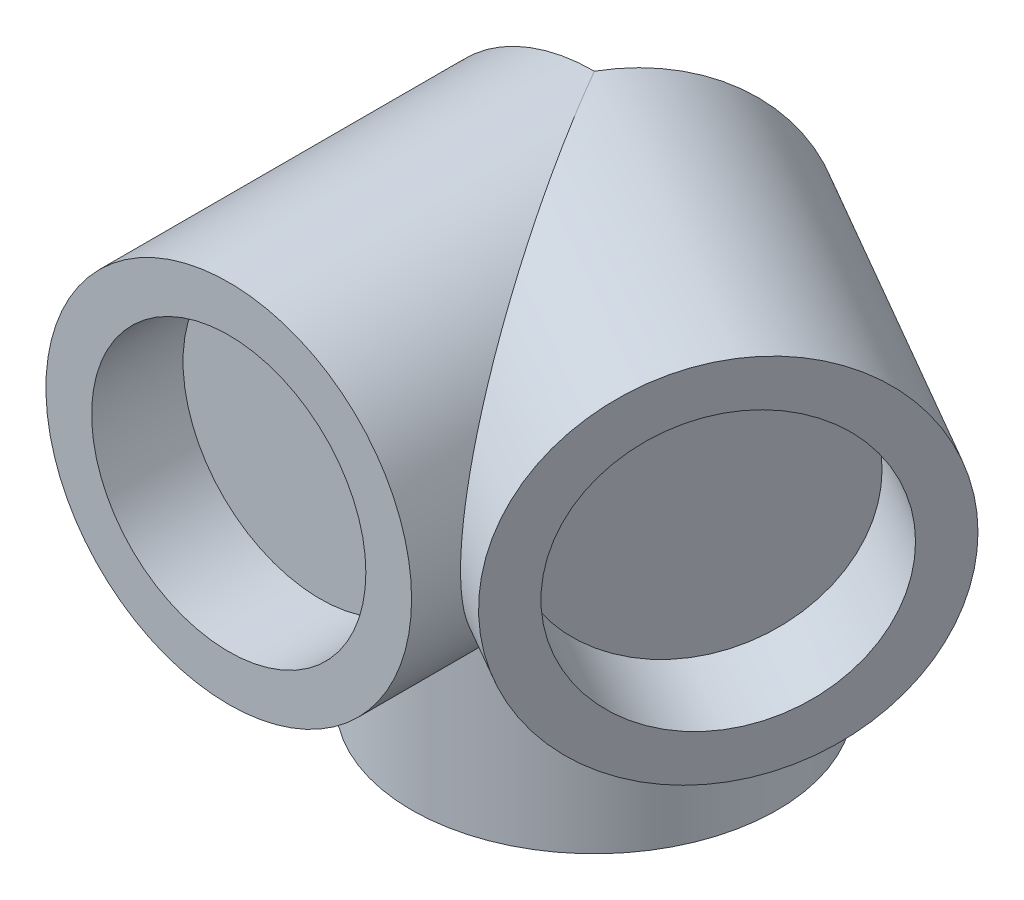
ISO-10303-21;
HEADER;
FILE_DESCRIPTION(('STEP AP214'),'2;1');
FILE_NAME('part.step','',(''),(''),'','','');
FILE_SCHEMA(('AUTOMOTIVE_DESIGN { 1 0 10303 214 1 1 1 1 }'));
ENDSEC;
DATA;
#1=APPLICATION_CONTEXT('core data for automotive mechanical design processes');
#2=APPLICATION_PROTOCOL_DEFINITION('international standard','automotive_design',2000,#1);
#3=PRODUCT_CONTEXT('',#1,'mechanical');
#4=PRODUCT('Part','Part','',(#3));
#5=PRODUCT_RELATED_PRODUCT_CATEGORY('part','',(#4));
#6=PRODUCT_DEFINITION_FORMATION('','',#4);
#7=PRODUCT_DEFINITION_CONTEXT('part definition',#1,'design');
#8=PRODUCT_DEFINITION('design','',#6,#7);
#9=PRODUCT_DEFINITION_SHAPE('','',#8);
#10=(LENGTH_UNIT() NAMED_UNIT(*) SI_UNIT(.MILLI.,.METRE.));
#11=(NAMED_UNIT(*) PLANE_ANGLE_UNIT() SI_UNIT($,.RADIAN.));
#12=(NAMED_UNIT(*) SI_UNIT($,.STERADIAN.) SOLID_ANGLE_UNIT());
#13=UNCERTAINTY_MEASURE_WITH_UNIT(LENGTH_MEASURE(1.E-05),#10,'distance_accuracy_value','');
#14=(GEOMETRIC_REPRESENTATION_CONTEXT(3) GLOBAL_UNCERTAINTY_ASSIGNED_CONTEXT((#13)) GLOBAL_UNIT_ASSIGNED_CONTEXT((#10,
#11,#12)) REPRESENTATION_CONTEXT('',''));
#15=CARTESIAN_POINT('',(0.,0.,0.));
#16=DIRECTION('',(0.,0.,1.));
#17=DIRECTION('',(1.,0.,0.));
#18=AXIS2_PLACEMENT_3D('',#15,#16,#17);
#19=CARTESIAN_POINT('',(17.3205080756888,10.,10.));
#20=DIRECTION('',(-0.866025403784438,0.,-0.500000000000001));
#21=DIRECTION('',(-0.500000000000001,0.,0.866025403784438));
#22=AXIS2_PLACEMENT_3D('',#19,#20,#21);
#23=CYLINDRICAL_SURFACE('',#22,10.);
#24=CARTESIAN_POINT('',(17.3205080756888,10.,10.));
#25=DIRECTION('',(0.866025403784438,0.,0.500000000000001));
#26=DIRECTION('',(0.500000000000001,0.,-0.866025403784438));
#27=AXIS2_PLACEMENT_3D('',#24,#25,#26);
#28=CIRCLE('',#27,10.);
#29=CARTESIAN_POINT('',(22.3205080756888,10.,1.33974596215564));
#30=VERTEX_POINT('',#29);
#31=EDGE_CURVE('E51',#30,#30,#28,.T.);
#32=ORIENTED_EDGE('',*,*,#31,.F.);
#33=EDGE_LOOP('',(#32));
#34=FACE_BOUND('',#33,.T.);
#35=CARTESIAN_POINT('',(0.,10.,0.));
#36=DIRECTION('',(-0.866025403784439,0.,0.5));
#37=DIRECTION('',(-0.5,0.,-0.866025403784439));
#38=AXIS2_PLACEMENT_3D('',#35,#36,#37);
#39=ELLIPSE('',#38,20.,10.);
#40=CARTESIAN_POINT('',(0.,0.,0.));
#41=VERTEX_POINT('',#40);
#42=CARTESIAN_POINT('',(0.,20.,0.));
#43=VERTEX_POINT('',#42);
#44=EDGE_CURVE('E62',#41,#43,#39,.T.);
#45=ORIENTED_EDGE('',*,*,#44,.F.);
#46=CARTESIAN_POINT('',(0.,10.,0.));
#47=DIRECTION('',(0.866025403784438,0.,0.500000000000001));
#48=DIRECTION('',(0.500000000000001,0.,-0.866025403784438));
#49=AXIS2_PLACEMENT_3D('',#46,#47,#48);
#50=CIRCLE('',#49,10.);
#51=EDGE_CURVE('E57',#41,#43,#50,.T.);
#52=ORIENTED_EDGE('',*,*,#51,.T.);
#53=EDGE_LOOP('',(#45,#52));
#54=FACE_BOUND('',#53,.T.);
#55=ADVANCED_FACE('F44',(#34,#54),#23,.T.);
#56=CARTESIAN_POINT('',(0.,10.,0.));
#57=DIRECTION('',(0.866025403784438,0.,0.500000000000001));
#58=DIRECTION('',(0.500000000000001,0.,-0.866025403784438));
#59=AXIS2_PLACEMENT_3D('',#56,#57,#58);
#60=PLANE('',#59);
#61=DIRECTION('',(0.,-1.,0.));
#62=VECTOR('',#61,1.);
#63=CARTESIAN_POINT('',(0.,10.,0.));
#64=LINE('',#63,#62);
#65=EDGE_CURVE('E12',#43,#41,#64,.T.);
#66=ORIENTED_EDGE('',*,*,#65,.F.);
#67=ORIENTED_EDGE('',*,*,#51,.F.);
#68=EDGE_LOOP('',(#66,#67));
#69=FACE_BOUND('',#68,.T.);
#70=ADVANCED_FACE('F59',(#69),#60,.F.);
#71=CARTESIAN_POINT('',(17.3205080756888,10.,10.));
#72=DIRECTION('',(0.866025403784438,0.,0.500000000000001));
#73=DIRECTION('',(0.500000000000001,0.,-0.866025403784438));
#74=AXIS2_PLACEMENT_3D('',#71,#72,#73);
#75=PLANE('',#74);
#76=CARTESIAN_POINT('',(17.3205080756888,10.,10.));
#77=DIRECTION('',(0.866025403784438,0.,0.500000000000001));
#78=DIRECTION('',(0.500000000000001,0.,-0.866025403784438));
#79=AXIS2_PLACEMENT_3D('',#76,#77,#78);
#80=CIRCLE('',#79,7.5);
#81=CARTESIAN_POINT('',(21.0705080756888,10.,3.50480947161674));
#82=VERTEX_POINT('',#81);
#83=EDGE_CURVE('E125',#82,#82,#80,.T.);
#84=ORIENTED_EDGE('',*,*,#83,.F.);
#85=EDGE_LOOP('',(#84));
#86=FACE_BOUND('',#85,.T.);
#87=ORIENTED_EDGE('',*,*,#31,.T.);
#88=EDGE_LOOP('',(#87));
#89=FACE_BOUND('',#88,.T.);
#90=ADVANCED_FACE('F84',(#86,#89),#75,.T.);
#91=CARTESIAN_POINT('',(0.,10.,20.));
#92=DIRECTION('',(0.,0.,-1.));
#93=DIRECTION('',(-1.,0.,0.));
#94=AXIS2_PLACEMENT_3D('',#91,#92,#93);
#95=CYLINDRICAL_SURFACE('',#94,10.);
#96=CARTESIAN_POINT('',(0.,10.,20.));
#97=DIRECTION('',(0.,0.,1.));
#98=DIRECTION('',(1.,0.,0.));
#99=AXIS2_PLACEMENT_3D('',#96,#97,#98);
#100=CIRCLE('',#99,10.);
#101=CARTESIAN_POINT('',(10.,10.,20.));
#102=VERTEX_POINT('',#101);
#103=EDGE_CURVE('E66',#102,#102,#100,.T.);
#104=ORIENTED_EDGE('',*,*,#103,.F.);
#105=EDGE_LOOP('',(#104));
#106=FACE_BOUND('',#105,.T.);
#107=CARTESIAN_POINT('',(0.,10.,0.));
#108=DIRECTION('',(0.,0.,1.));
#109=DIRECTION('',(1.,0.,0.));
#110=AXIS2_PLACEMENT_3D('',#107,#108,#109);
#111=CIRCLE('',#110,10.);
#112=EDGE_CURVE('E70',#43,#41,#111,.T.);
#113=ORIENTED_EDGE('',*,*,#112,.T.);
#114=ORIENTED_EDGE('',*,*,#44,.T.);
#115=EDGE_LOOP('',(#113,#114));
#116=FACE_BOUND('',#115,.T.);
#117=ADVANCED_FACE('F71',(#106,#116),#95,.T.);
#118=CARTESIAN_POINT('',(0.,10.,0.));
#119=DIRECTION('',(0.,0.,1.));
#120=DIRECTION('',(1.,0.,0.));
#121=AXIS2_PLACEMENT_3D('',#118,#119,#120);
#122=PLANE('',#121);
#123=ORIENTED_EDGE('',*,*,#112,.F.);
#124=ORIENTED_EDGE('',*,*,#65,.T.);
#125=EDGE_LOOP('',(#123,#124));
#126=FACE_BOUND('',#125,.T.);
#127=ADVANCED_FACE('F69',(#126),#122,.F.);
#128=CARTESIAN_POINT('',(0.,10.,20.));
#129=DIRECTION('',(0.,0.,1.));
#130=DIRECTION('',(1.,0.,0.));
#131=AXIS2_PLACEMENT_3D('',#128,#129,#130);
#132=PLANE('',#131);
#133=CARTESIAN_POINT('',(0.,10.,20.));
#134=DIRECTION('',(0.,0.,1.));
#135=DIRECTION('',(1.,0.,0.));
#136=AXIS2_PLACEMENT_3D('',#133,#134,#135);
#137=CIRCLE('',#136,7.5);
#138=CARTESIAN_POINT('',(7.5,10.,20.));
#139=VERTEX_POINT('',#138);
#140=EDGE_CURVE('E77',#139,#139,#137,.T.);
#141=ORIENTED_EDGE('',*,*,#140,.F.);
#142=EDGE_LOOP('',(#141));
#143=FACE_BOUND('',#142,.T.);
#144=ORIENTED_EDGE('',*,*,#103,.T.);
#145=EDGE_LOOP('',(#144));
#146=FACE_BOUND('',#145,.T.);
#147=ADVANCED_FACE('F101',(#143,#146),#132,.T.);
#148=CARTESIAN_POINT('',(0.,10.,15.));
#149=DIRECTION('',(0.,0.,1.));
#150=DIRECTION('',(1.,0.,0.));
#151=AXIS2_PLACEMENT_3D('',#148,#149,#150);
#152=CYLINDRICAL_SURFACE('',#151,7.5);
#153=CARTESIAN_POINT('',(0.,10.,15.));
#154=DIRECTION('',(0.,0.,1.));
#155=DIRECTION('',(1.,0.,0.));
#156=AXIS2_PLACEMENT_3D('',#153,#154,#155);
#157=CIRCLE('',#156,7.5);
#158=CARTESIAN_POINT('',(7.5,10.,15.));
#159=VERTEX_POINT('',#158);
#160=EDGE_CURVE('E72',#159,#159,#157,.T.);
#161=ORIENTED_EDGE('',*,*,#160,.F.);
#162=EDGE_LOOP('',(#161));
#163=FACE_BOUND('',#162,.T.);
#164=ORIENTED_EDGE('',*,*,#140,.T.);
#165=EDGE_LOOP('',(#164));
#166=FACE_BOUND('',#165,.T.);
#167=ADVANCED_FACE('F104',(#163,#166),#152,.F.);
#168=CARTESIAN_POINT('',(0.,10.,15.));
#169=DIRECTION('',(0.,0.,1.));
#170=DIRECTION('',(1.,0.,0.));
#171=AXIS2_PLACEMENT_3D('',#168,#169,#170);
#172=PLANE('',#171);
#173=ORIENTED_EDGE('',*,*,#160,.T.);
#174=EDGE_LOOP('',(#173));
#175=FACE_BOUND('',#174,.T.);
#176=ADVANCED_FACE('F108',(#175),#172,.T.);
#177=CARTESIAN_POINT('',(12.9903810567666,10.,7.50000000000002));
#178=DIRECTION('',(0.866025403784438,0.,0.500000000000001));
#179=DIRECTION('',(0.500000000000001,0.,-0.866025403784438));
#180=AXIS2_PLACEMENT_3D('',#177,#178,#179);
#181=CYLINDRICAL_SURFACE('',#180,7.5);
#182=CARTESIAN_POINT('',(12.9903810567666,10.,7.50000000000002));
#183=DIRECTION('',(0.866025403784438,0.,0.500000000000001));
#184=DIRECTION('',(0.500000000000001,0.,-0.866025403784438));
#185=AXIS2_PLACEMENT_3D('',#182,#183,#184);
#186=CIRCLE('',#185,7.5);
#187=CARTESIAN_POINT('',(16.7403810567666,10.,1.00480947161673));
#188=VERTEX_POINT('',#187);
#189=EDGE_CURVE('E124',#188,#188,#186,.T.);
#190=ORIENTED_EDGE('',*,*,#189,.F.);
#191=EDGE_LOOP('',(#190));
#192=FACE_BOUND('',#191,.T.);
#193=ORIENTED_EDGE('',*,*,#83,.T.);
#194=EDGE_LOOP('',(#193));
#195=FACE_BOUND('',#194,.T.);
#196=ADVANCED_FACE('F112',(#192,#195),#181,.F.);
#197=CARTESIAN_POINT('',(12.9903810567666,10.,7.50000000000002));
#198=DIRECTION('',(0.866025403784438,0.,0.500000000000001));
#199=DIRECTION('',(0.500000000000001,0.,-0.866025403784438));
#200=AXIS2_PLACEMENT_3D('',#197,#198,#199);
#201=PLANE('',#200);
#202=ORIENTED_EDGE('',*,*,#189,.T.);
#203=EDGE_LOOP('',(#202));
#204=FACE_BOUND('',#203,.T.);
#205=ADVANCED_FACE('F116',(#204),#201,.T.);
#206=CLOSED_SHELL('',(#55,#70,#90,#117,#127,#147,#167,#176,#196,#205));
#207=MANIFOLD_SOLID_BREP('B2',#206);
#208=CARTESIAN_POINT('',(0.,-10.,0.));
#209=DIRECTION('',(0.,1.,0.));
#210=DIRECTION('',(0.,0.,1.));
#211=AXIS2_PLACEMENT_3D('',#208,#209,#210);
#212=CYLINDRICAL_SURFACE('',#211,10.);
#213=CARTESIAN_POINT('',(0.,-10.,0.));
#214=DIRECTION('',(0.,1.,0.));
#215=DIRECTION('',(0.,0.,1.));
#216=AXIS2_PLACEMENT_3D('',#213,#214,#215);
#217=CIRCLE('',#216,10.);
#218=CARTESIAN_POINT('',(0.,-10.,10.));
#219=VERTEX_POINT('',#218);
#220=EDGE_CURVE('E43',#219,#219,#217,.T.);
#221=ORIENTED_EDGE('',*,*,#220,.T.);
#222=EDGE_LOOP('',(#221));
#223=FACE_BOUND('',#222,.T.);
#224=CARTESIAN_POINT('',(0.,0.,0.));
#225=DIRECTION('',(0.,1.,0.));
#226=DIRECTION('',(0.,0.,1.));
#227=AXIS2_PLACEMENT_3D('',#224,#225,#226);
#228=CIRCLE('',#227,10.);
#229=CARTESIAN_POINT('',(0.,0.,10.));
#230=VERTEX_POINT('',#229);
#231=EDGE_CURVE('E196',#230,#230,#228,.T.);
#232=ORIENTED_EDGE('',*,*,#231,.F.);
#233=EDGE_LOOP('',(#232));
#234=FACE_BOUND('',#233,.T.);
#235=ADVANCED_FACE('F193',(#223,#234),#212,.T.);
#236=CARTESIAN_POINT('',(0.,-10.,0.));
#237=DIRECTION('',(0.,1.,0.));
#238=DIRECTION('',(0.,0.,1.));
#239=AXIS2_PLACEMENT_3D('',#236,#237,#238);
#240=PLANE('',#239);
#241=CARTESIAN_POINT('',(0.,-10.,0.));
#242=DIRECTION('',(0.,-1.,0.));
#243=DIRECTION('',(0.,0.,-1.));
#244=AXIS2_PLACEMENT_3D('',#241,#242,#243);
#245=CIRCLE('',#244,7.5);
#246=CARTESIAN_POINT('',(0.,-10.,-7.5));
#247=VERTEX_POINT('',#246);
#248=EDGE_CURVE('E205',#247,#247,#245,.T.);
#249=ORIENTED_EDGE('',*,*,#248,.F.);
#250=EDGE_LOOP('',(#249));
#251=FACE_BOUND('',#250,.T.);
#252=ORIENTED_EDGE('',*,*,#220,.F.);
#253=EDGE_LOOP('',(#252));
#254=FACE_BOUND('',#253,.T.);
#255=ADVANCED_FACE('F220',(#251,#254),#240,.F.);
#256=CARTESIAN_POINT('',(0.,0.,0.));
#257=DIRECTION('',(0.,1.,0.));
#258=DIRECTION('',(0.,0.,1.));
#259=AXIS2_PLACEMENT_3D('',#256,#257,#258);
#260=PLANE('',#259);
#261=ORIENTED_EDGE('',*,*,#231,.T.);
#262=EDGE_LOOP('',(#261));
#263=FACE_BOUND('',#262,.T.);
#264=ADVANCED_FACE('F216',(#263),#260,.T.);
#265=CARTESIAN_POINT('',(0.,-5.,0.));
#266=DIRECTION('',(0.,-1.,0.));
#267=DIRECTION('',(0.,0.,-1.));
#268=AXIS2_PLACEMENT_3D('',#265,#266,#267);
#269=CYLINDRICAL_SURFACE('',#268,7.5);
#270=CARTESIAN_POINT('',(0.,-5.,0.));
#271=DIRECTION('',(0.,-1.,0.));
#272=DIRECTION('',(0.,0.,-1.));
#273=AXIS2_PLACEMENT_3D('',#270,#271,#272);
#274=CIRCLE('',#273,7.5);
#275=CARTESIAN_POINT('',(0.,-5.,-7.5));
#276=VERTEX_POINT('',#275);
#277=EDGE_CURVE('E203',#276,#276,#274,.T.);
#278=ORIENTED_EDGE('',*,*,#277,.F.);
#279=EDGE_LOOP('',(#278));
#280=FACE_BOUND('',#279,.T.);
#281=ORIENTED_EDGE('',*,*,#248,.T.);
#282=EDGE_LOOP('',(#281));
#283=FACE_BOUND('',#282,.T.);
#284=ADVANCED_FACE('F213',(#280,#283),#269,.F.);
#285=CARTESIAN_POINT('',(0.,-5.,0.));
#286=DIRECTION('',(0.,-1.,0.));
#287=DIRECTION('',(0.,0.,-1.));
#288=AXIS2_PLACEMENT_3D('',#285,#286,#287);
#289=PLANE('',#288);
#290=ORIENTED_EDGE('',*,*,#277,.T.);
#291=EDGE_LOOP('',(#290));
#292=FACE_BOUND('',#291,.T.);
#293=ADVANCED_FACE('F211',(#292),#289,.T.);
#294=CLOSED_SHELL('',(#235,#255,#264,#284,#293));
#295=MANIFOLD_SOLID_BREP('B6',#294);
#296=ADVANCED_BREP_SHAPE_REPRESENTATION('',(#18,#207,#295),#14);
#297=SHAPE_DEFINITION_REPRESENTATION(#9,#296);
ENDSEC;
END-ISO-10303-21;
